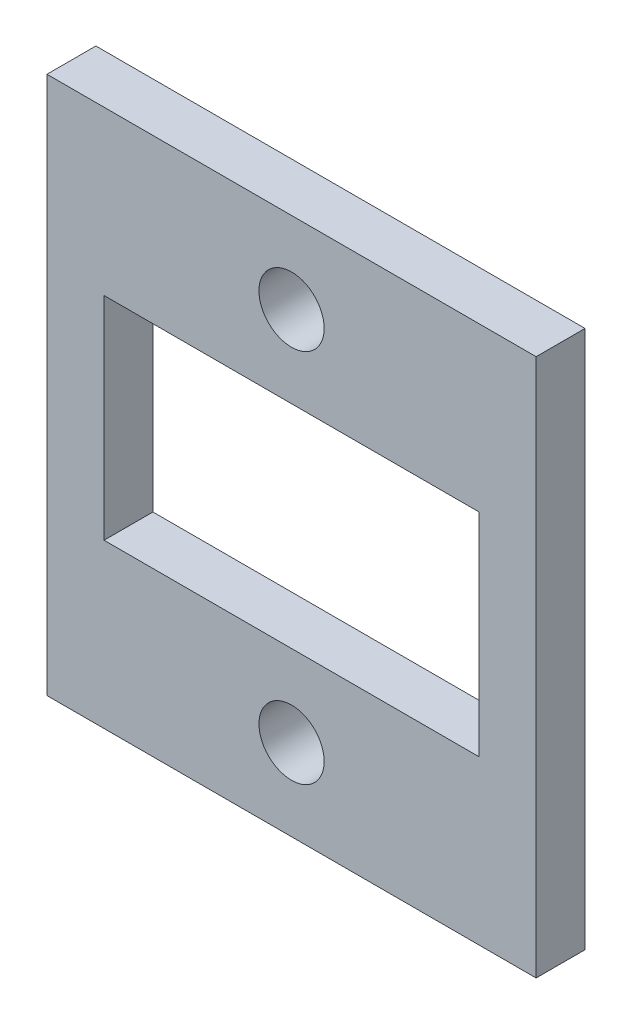
ISO-10303-21;
HEADER;
FILE_DESCRIPTION(('STEP AP214'),'2;1');
FILE_NAME('part.step','',(''),(''),'','','');
FILE_SCHEMA(('AUTOMOTIVE_DESIGN { 1 0 10303 214 1 1 1 1 }'));
ENDSEC;
DATA;
#1=APPLICATION_CONTEXT('core data for automotive mechanical design processes');
#2=APPLICATION_PROTOCOL_DEFINITION('international standard','automotive_design',2000,#1);
#3=PRODUCT_CONTEXT('',#1,'mechanical');
#4=PRODUCT('Part','Part','',(#3));
#5=PRODUCT_RELATED_PRODUCT_CATEGORY('part','',(#4));
#6=PRODUCT_DEFINITION_FORMATION('','',#4);
#7=PRODUCT_DEFINITION_CONTEXT('part definition',#1,'design');
#8=PRODUCT_DEFINITION('design','',#6,#7);
#9=PRODUCT_DEFINITION_SHAPE('','',#8);
#10=(LENGTH_UNIT() NAMED_UNIT(*) SI_UNIT(.MILLI.,.METRE.));
#11=(NAMED_UNIT(*) PLANE_ANGLE_UNIT() SI_UNIT($,.RADIAN.));
#12=(NAMED_UNIT(*) SI_UNIT($,.STERADIAN.) SOLID_ANGLE_UNIT());
#13=UNCERTAINTY_MEASURE_WITH_UNIT(LENGTH_MEASURE(1.E-05),#10,'distance_accuracy_value','');
#14=(GEOMETRIC_REPRESENTATION_CONTEXT(3) GLOBAL_UNCERTAINTY_ASSIGNED_CONTEXT((#13)) GLOBAL_UNIT_ASSIGNED_CONTEXT((#10,
#11,#12)) REPRESENTATION_CONTEXT('',''));
#15=CARTESIAN_POINT('',(0.,0.,0.));
#16=DIRECTION('',(0.,0.,1.));
#17=DIRECTION('',(1.,0.,0.));
#18=AXIS2_PLACEMENT_3D('',#15,#16,#17);
#19=CARTESIAN_POINT('',(15.,16.5,3.));
#20=DIRECTION('',(-1.,0.,0.));
#21=DIRECTION('',(0.,-1.,0.));
#22=AXIS2_PLACEMENT_3D('',#19,#20,#21);
#23=PLANE('',#22);
#24=DIRECTION('',(0.,1.,0.));
#25=VECTOR('',#24,1.);
#26=CARTESIAN_POINT('',(15.,16.5,0.));
#27=LINE('',#26,#25);
#28=CARTESIAN_POINT('',(15.,-16.5,0.));
#29=VERTEX_POINT('',#28);
#30=CARTESIAN_POINT('',(15.,16.5,0.));
#31=VERTEX_POINT('',#30);
#32=EDGE_CURVE('E152',#29,#31,#27,.T.);
#33=ORIENTED_EDGE('',*,*,#32,.T.);
#34=DIRECTION('',(0.,0.,-1.));
#35=VECTOR('',#34,1.);
#36=CARTESIAN_POINT('',(15.,16.5,3.));
#37=LINE('',#36,#35);
#38=CARTESIAN_POINT('',(15.,16.5,3.));
#39=VERTEX_POINT('',#38);
#40=EDGE_CURVE('E11',#39,#31,#37,.T.);
#41=ORIENTED_EDGE('',*,*,#40,.F.);
#42=DIRECTION('',(0.,1.,0.));
#43=VECTOR('',#42,1.);
#44=CARTESIAN_POINT('',(15.,16.5,3.));
#45=LINE('',#44,#43);
#46=CARTESIAN_POINT('',(15.,-16.5,3.));
#47=VERTEX_POINT('',#46);
#48=EDGE_CURVE('E158',#47,#39,#45,.T.);
#49=ORIENTED_EDGE('',*,*,#48,.F.);
#50=DIRECTION('',(0.,0.,-1.));
#51=VECTOR('',#50,1.);
#52=CARTESIAN_POINT('',(15.,-16.5,3.));
#53=LINE('',#52,#51);
#54=EDGE_CURVE('E172',#47,#29,#53,.T.);
#55=ORIENTED_EDGE('',*,*,#54,.T.);
#56=EDGE_LOOP('',(#33,#41,#49,#55));
#57=FACE_BOUND('',#56,.T.);
#58=ADVANCED_FACE('F40',(#57),#23,.F.);
#59=CARTESIAN_POINT('',(-15.,16.5,3.));
#60=DIRECTION('',(0.,-1.,0.));
#61=DIRECTION('',(0.,0.,-1.));
#62=AXIS2_PLACEMENT_3D('',#59,#60,#61);
#63=PLANE('',#62);
#64=DIRECTION('',(-1.,0.,0.));
#65=VECTOR('',#64,1.);
#66=CARTESIAN_POINT('',(-15.,16.5,0.));
#67=LINE('',#66,#65);
#68=CARTESIAN_POINT('',(-15.,16.5,0.));
#69=VERTEX_POINT('',#68);
#70=EDGE_CURVE('E176',#31,#69,#67,.T.);
#71=ORIENTED_EDGE('',*,*,#70,.T.);
#72=DIRECTION('',(0.,0.,-1.));
#73=VECTOR('',#72,1.);
#74=CARTESIAN_POINT('',(-15.,16.5,3.));
#75=LINE('',#74,#73);
#76=CARTESIAN_POINT('',(-15.,16.5,3.));
#77=VERTEX_POINT('',#76);
#78=EDGE_CURVE('E48',#77,#69,#75,.T.);
#79=ORIENTED_EDGE('',*,*,#78,.F.);
#80=DIRECTION('',(-1.,0.,0.));
#81=VECTOR('',#80,1.);
#82=CARTESIAN_POINT('',(-15.,16.5,3.));
#83=LINE('',#82,#81);
#84=EDGE_CURVE('E162',#39,#77,#83,.T.);
#85=ORIENTED_EDGE('',*,*,#84,.F.);
#86=ORIENTED_EDGE('',*,*,#40,.T.);
#87=EDGE_LOOP('',(#71,#79,#85,#86));
#88=FACE_BOUND('',#87,.T.);
#89=ADVANCED_FACE('F210',(#88),#63,.F.);
#90=CARTESIAN_POINT('',(-15.,16.5,3.));
#91=DIRECTION('',(1.,0.,0.));
#92=DIRECTION('',(0.,1.,0.));
#93=AXIS2_PLACEMENT_3D('',#90,#91,#92);
#94=PLANE('',#93);
#95=DIRECTION('',(0.,-1.,0.));
#96=VECTOR('',#95,1.);
#97=CARTESIAN_POINT('',(-15.,16.5,0.));
#98=LINE('',#97,#96);
#99=CARTESIAN_POINT('',(-15.,-16.5,0.));
#100=VERTEX_POINT('',#99);
#101=EDGE_CURVE('E179',#69,#100,#98,.T.);
#102=ORIENTED_EDGE('',*,*,#101,.T.);
#103=DIRECTION('',(0.,0.,-1.));
#104=VECTOR('',#103,1.);
#105=CARTESIAN_POINT('',(-15.,-16.5,3.));
#106=LINE('',#105,#104);
#107=CARTESIAN_POINT('',(-15.,-16.5,3.));
#108=VERTEX_POINT('',#107);
#109=EDGE_CURVE('E187',#108,#100,#106,.T.);
#110=ORIENTED_EDGE('',*,*,#109,.F.);
#111=DIRECTION('',(0.,-1.,0.));
#112=VECTOR('',#111,1.);
#113=CARTESIAN_POINT('',(-15.,16.5,3.));
#114=LINE('',#113,#112);
#115=EDGE_CURVE('E166',#77,#108,#114,.T.);
#116=ORIENTED_EDGE('',*,*,#115,.F.);
#117=ORIENTED_EDGE('',*,*,#78,.T.);
#118=EDGE_LOOP('',(#102,#110,#116,#117));
#119=FACE_BOUND('',#118,.T.);
#120=ADVANCED_FACE('F196',(#119),#94,.F.);
#121=CARTESIAN_POINT('',(-15.,-16.5,3.));
#122=DIRECTION('',(0.,1.,0.));
#123=DIRECTION('',(0.,0.,1.));
#124=AXIS2_PLACEMENT_3D('',#121,#122,#123);
#125=PLANE('',#124);
#126=DIRECTION('',(1.,0.,0.));
#127=VECTOR('',#126,1.);
#128=CARTESIAN_POINT('',(-15.,-16.5,0.));
#129=LINE('',#128,#127);
#130=EDGE_CURVE('E163',#100,#29,#129,.T.);
#131=ORIENTED_EDGE('',*,*,#130,.T.);
#132=ORIENTED_EDGE('',*,*,#54,.F.);
#133=DIRECTION('',(1.,0.,0.));
#134=VECTOR('',#133,1.);
#135=CARTESIAN_POINT('',(-15.,-16.5,3.));
#136=LINE('',#135,#134);
#137=EDGE_CURVE('E169',#108,#47,#136,.T.);
#138=ORIENTED_EDGE('',*,*,#137,.F.);
#139=ORIENTED_EDGE('',*,*,#109,.T.);
#140=EDGE_LOOP('',(#131,#132,#138,#139));
#141=FACE_BOUND('',#140,.T.);
#142=ADVANCED_FACE('F203',(#141),#125,.F.);
#143=CARTESIAN_POINT('',(0.,0.,3.));
#144=DIRECTION('',(0.,0.,1.));
#145=DIRECTION('',(1.,0.,0.));
#146=AXIS2_PLACEMENT_3D('',#143,#144,#145);
#147=PLANE('',#146);
#148=CARTESIAN_POINT('',(0.,11.5,3.));
#149=DIRECTION('',(0.,0.,1.));
#150=DIRECTION('',(1.,0.,0.));
#151=AXIS2_PLACEMENT_3D('',#148,#149,#150);
#152=CIRCLE('',#151,2.);
#153=CARTESIAN_POINT('',(2.,11.5,3.));
#154=VERTEX_POINT('',#153);
#155=EDGE_CURVE('E251',#154,#154,#152,.T.);
#156=ORIENTED_EDGE('',*,*,#155,.F.);
#157=EDGE_LOOP('',(#156));
#158=FACE_BOUND('',#157,.T.);
#159=CARTESIAN_POINT('',(0.,-11.5,3.));
#160=DIRECTION('',(0.,0.,1.));
#161=DIRECTION('',(1.,0.,0.));
#162=AXIS2_PLACEMENT_3D('',#159,#160,#161);
#163=CIRCLE('',#162,2.);
#164=CARTESIAN_POINT('',(2.,-11.5,3.));
#165=VERTEX_POINT('',#164);
#166=EDGE_CURVE('E133',#165,#165,#163,.T.);
#167=ORIENTED_EDGE('',*,*,#166,.F.);
#168=EDGE_LOOP('',(#167));
#169=FACE_BOUND('',#168,.T.);
#170=DIRECTION('',(0.,1.,0.));
#171=VECTOR('',#170,1.);
#172=CARTESIAN_POINT('',(11.5,6.5,3.));
#173=LINE('',#172,#171);
#174=CARTESIAN_POINT('',(11.5,-6.5,3.));
#175=VERTEX_POINT('',#174);
#176=CARTESIAN_POINT('',(11.5,6.5,3.));
#177=VERTEX_POINT('',#176);
#178=EDGE_CURVE('E55',#175,#177,#173,.T.);
#179=ORIENTED_EDGE('',*,*,#178,.F.);
#180=DIRECTION('',(1.,0.,0.));
#181=VECTOR('',#180,1.);
#182=CARTESIAN_POINT('',(-11.5,-6.5,3.));
#183=LINE('',#182,#181);
#184=CARTESIAN_POINT('',(-11.5,-6.5,3.));
#185=VERTEX_POINT('',#184);
#186=EDGE_CURVE('E126',#185,#175,#183,.T.);
#187=ORIENTED_EDGE('',*,*,#186,.F.);
#188=DIRECTION('',(0.,-1.,0.));
#189=VECTOR('',#188,1.);
#190=CARTESIAN_POINT('',(-11.5,6.5,3.));
#191=LINE('',#190,#189);
#192=CARTESIAN_POINT('',(-11.5,6.5,3.));
#193=VERTEX_POINT('',#192);
#194=EDGE_CURVE('E130',#193,#185,#191,.T.);
#195=ORIENTED_EDGE('',*,*,#194,.F.);
#196=DIRECTION('',(-1.,0.,0.));
#197=VECTOR('',#196,1.);
#198=CARTESIAN_POINT('',(-11.5,6.5,3.));
#199=LINE('',#198,#197);
#200=EDGE_CURVE('E142',#177,#193,#199,.T.);
#201=ORIENTED_EDGE('',*,*,#200,.F.);
#202=EDGE_LOOP('',(#179,#187,#195,#201));
#203=FACE_BOUND('',#202,.T.);
#204=ORIENTED_EDGE('',*,*,#48,.T.);
#205=ORIENTED_EDGE('',*,*,#84,.T.);
#206=ORIENTED_EDGE('',*,*,#115,.T.);
#207=ORIENTED_EDGE('',*,*,#137,.T.);
#208=EDGE_LOOP('',(#204,#205,#206,#207));
#209=FACE_BOUND('',#208,.T.);
#210=ADVANCED_FACE('F209',(#158,#169,#203,#209),#147,.T.);
#211=CARTESIAN_POINT('',(0.,0.,0.));
#212=DIRECTION('',(0.,0.,1.));
#213=DIRECTION('',(1.,0.,0.));
#214=AXIS2_PLACEMENT_3D('',#211,#212,#213);
#215=PLANE('',#214);
#216=CARTESIAN_POINT('',(0.,11.5,0.));
#217=DIRECTION('',(0.,0.,1.));
#218=DIRECTION('',(1.,0.,0.));
#219=AXIS2_PLACEMENT_3D('',#216,#217,#218);
#220=CIRCLE('',#219,2.);
#221=CARTESIAN_POINT('',(2.,11.5,0.));
#222=VERTEX_POINT('',#221);
#223=EDGE_CURVE('E143',#222,#222,#220,.T.);
#224=ORIENTED_EDGE('',*,*,#223,.T.);
#225=EDGE_LOOP('',(#224));
#226=FACE_BOUND('',#225,.T.);
#227=CARTESIAN_POINT('',(0.,-11.5,0.));
#228=DIRECTION('',(0.,0.,1.));
#229=DIRECTION('',(1.,0.,0.));
#230=AXIS2_PLACEMENT_3D('',#227,#228,#229);
#231=CIRCLE('',#230,2.);
#232=CARTESIAN_POINT('',(2.,-11.5,0.));
#233=VERTEX_POINT('',#232);
#234=EDGE_CURVE('E253',#233,#233,#231,.T.);
#235=ORIENTED_EDGE('',*,*,#234,.T.);
#236=EDGE_LOOP('',(#235));
#237=FACE_BOUND('',#236,.T.);
#238=DIRECTION('',(1.,0.,0.));
#239=VECTOR('',#238,1.);
#240=CARTESIAN_POINT('',(-11.5,-6.5,0.));
#241=LINE('',#240,#239);
#242=CARTESIAN_POINT('',(-11.5,-6.5,0.));
#243=VERTEX_POINT('',#242);
#244=CARTESIAN_POINT('',(11.5,-6.5,0.));
#245=VERTEX_POINT('',#244);
#246=EDGE_CURVE('E114',#243,#245,#241,.T.);
#247=ORIENTED_EDGE('',*,*,#246,.T.);
#248=DIRECTION('',(0.,1.,0.));
#249=VECTOR('',#248,1.);
#250=CARTESIAN_POINT('',(11.5,6.5,0.));
#251=LINE('',#250,#249);
#252=CARTESIAN_POINT('',(11.5,6.5,0.));
#253=VERTEX_POINT('',#252);
#254=EDGE_CURVE('E107',#245,#253,#251,.T.);
#255=ORIENTED_EDGE('',*,*,#254,.T.);
#256=DIRECTION('',(-1.,0.,0.));
#257=VECTOR('',#256,1.);
#258=CARTESIAN_POINT('',(-11.5,6.5,0.));
#259=LINE('',#258,#257);
#260=CARTESIAN_POINT('',(-11.5,6.5,0.));
#261=VERTEX_POINT('',#260);
#262=EDGE_CURVE('E117',#253,#261,#259,.T.);
#263=ORIENTED_EDGE('',*,*,#262,.T.);
#264=DIRECTION('',(0.,-1.,0.));
#265=VECTOR('',#264,1.);
#266=CARTESIAN_POINT('',(-11.5,6.5,0.));
#267=LINE('',#266,#265);
#268=EDGE_CURVE('E63',#261,#243,#267,.T.);
#269=ORIENTED_EDGE('',*,*,#268,.T.);
#270=EDGE_LOOP('',(#247,#255,#263,#269));
#271=FACE_BOUND('',#270,.T.);
#272=ORIENTED_EDGE('',*,*,#32,.F.);
#273=ORIENTED_EDGE('',*,*,#130,.F.);
#274=ORIENTED_EDGE('',*,*,#101,.F.);
#275=ORIENTED_EDGE('',*,*,#70,.F.);
#276=EDGE_LOOP('',(#272,#273,#274,#275));
#277=FACE_BOUND('',#276,.T.);
#278=ADVANCED_FACE('F122',(#226,#237,#271,#277),#215,.F.);
#279=CARTESIAN_POINT('',(11.5,6.5,0.));
#280=DIRECTION('',(1.,0.,0.));
#281=DIRECTION('',(0.,0.,-1.));
#282=AXIS2_PLACEMENT_3D('',#279,#280,#281);
#283=PLANE('',#282);
#284=ORIENTED_EDGE('',*,*,#178,.T.);
#285=DIRECTION('',(0.,0.,1.));
#286=VECTOR('',#285,1.);
#287=CARTESIAN_POINT('',(11.5,6.5,0.));
#288=LINE('',#287,#286);
#289=EDGE_CURVE('E103',#253,#177,#288,.T.);
#290=ORIENTED_EDGE('',*,*,#289,.F.);
#291=ORIENTED_EDGE('',*,*,#254,.F.);
#292=DIRECTION('',(0.,0.,1.));
#293=VECTOR('',#292,1.);
#294=CARTESIAN_POINT('',(11.5,-6.5,0.));
#295=LINE('',#294,#293);
#296=EDGE_CURVE('E149',#245,#175,#295,.T.);
#297=ORIENTED_EDGE('',*,*,#296,.T.);
#298=EDGE_LOOP('',(#284,#290,#291,#297));
#299=FACE_BOUND('',#298,.T.);
#300=ADVANCED_FACE('F105',(#299),#283,.F.);
#301=CARTESIAN_POINT('',(-11.5,-6.5,0.));
#302=DIRECTION('',(0.,-1.,0.));
#303=DIRECTION('',(0.,0.,-1.));
#304=AXIS2_PLACEMENT_3D('',#301,#302,#303);
#305=PLANE('',#304);
#306=ORIENTED_EDGE('',*,*,#186,.T.);
#307=ORIENTED_EDGE('',*,*,#296,.F.);
#308=ORIENTED_EDGE('',*,*,#246,.F.);
#309=DIRECTION('',(0.,0.,1.));
#310=VECTOR('',#309,1.);
#311=CARTESIAN_POINT('',(-11.5,-6.5,0.));
#312=LINE('',#311,#310);
#313=EDGE_CURVE('E153',#243,#185,#312,.T.);
#314=ORIENTED_EDGE('',*,*,#313,.T.);
#315=EDGE_LOOP('',(#306,#307,#308,#314));
#316=FACE_BOUND('',#315,.T.);
#317=ADVANCED_FACE('F228',(#316),#305,.F.);
#318=CARTESIAN_POINT('',(-11.5,6.5,0.));
#319=DIRECTION('',(-1.,0.,0.));
#320=DIRECTION('',(0.,0.,1.));
#321=AXIS2_PLACEMENT_3D('',#318,#319,#320);
#322=PLANE('',#321);
#323=ORIENTED_EDGE('',*,*,#194,.T.);
#324=ORIENTED_EDGE('',*,*,#313,.F.);
#325=ORIENTED_EDGE('',*,*,#268,.F.);
#326=DIRECTION('',(0.,0.,1.));
#327=VECTOR('',#326,1.);
#328=CARTESIAN_POINT('',(-11.5,6.5,0.));
#329=LINE('',#328,#327);
#330=EDGE_CURVE('E113',#261,#193,#329,.T.);
#331=ORIENTED_EDGE('',*,*,#330,.T.);
#332=EDGE_LOOP('',(#323,#324,#325,#331));
#333=FACE_BOUND('',#332,.T.);
#334=ADVANCED_FACE('F232',(#333),#322,.F.);
#335=CARTESIAN_POINT('',(-11.5,6.5,0.));
#336=DIRECTION('',(0.,1.,0.));
#337=DIRECTION('',(0.,0.,1.));
#338=AXIS2_PLACEMENT_3D('',#335,#336,#337);
#339=PLANE('',#338);
#340=ORIENTED_EDGE('',*,*,#200,.T.);
#341=ORIENTED_EDGE('',*,*,#330,.F.);
#342=ORIENTED_EDGE('',*,*,#262,.F.);
#343=ORIENTED_EDGE('',*,*,#289,.T.);
#344=EDGE_LOOP('',(#340,#341,#342,#343));
#345=FACE_BOUND('',#344,.T.);
#346=ADVANCED_FACE('F118',(#345),#339,.F.);
#347=CARTESIAN_POINT('',(0.,-11.5,0.));
#348=DIRECTION('',(0.,0.,1.));
#349=DIRECTION('',(1.,0.,0.));
#350=AXIS2_PLACEMENT_3D('',#347,#348,#349);
#351=CYLINDRICAL_SURFACE('',#350,2.);
#352=ORIENTED_EDGE('',*,*,#234,.F.);
#353=EDGE_LOOP('',(#352));
#354=FACE_BOUND('',#353,.T.);
#355=ORIENTED_EDGE('',*,*,#166,.T.);
#356=EDGE_LOOP('',(#355));
#357=FACE_BOUND('',#356,.T.);
#358=ADVANCED_FACE('F231',(#354,#357),#351,.F.);
#359=CARTESIAN_POINT('',(0.,11.5,0.));
#360=DIRECTION('',(0.,0.,1.));
#361=DIRECTION('',(1.,0.,0.));
#362=AXIS2_PLACEMENT_3D('',#359,#360,#361);
#363=CYLINDRICAL_SURFACE('',#362,2.);
#364=ORIENTED_EDGE('',*,*,#223,.F.);
#365=EDGE_LOOP('',(#364));
#366=FACE_BOUND('',#365,.T.);
#367=ORIENTED_EDGE('',*,*,#155,.T.);
#368=EDGE_LOOP('',(#367));
#369=FACE_BOUND('',#368,.T.);
#370=ADVANCED_FACE('F240',(#366,#369),#363,.F.);
#371=CLOSED_SHELL('',(#58,#89,#120,#142,#210,#278,#300,#317,#334,#346,#358,#370));
#372=MANIFOLD_SOLID_BREP('B2',#371);
#373=ADVANCED_BREP_SHAPE_REPRESENTATION('',(#18,#372),#14);
#374=SHAPE_DEFINITION_REPRESENTATION(#9,#373);
ENDSEC;
END-ISO-10303-21;
